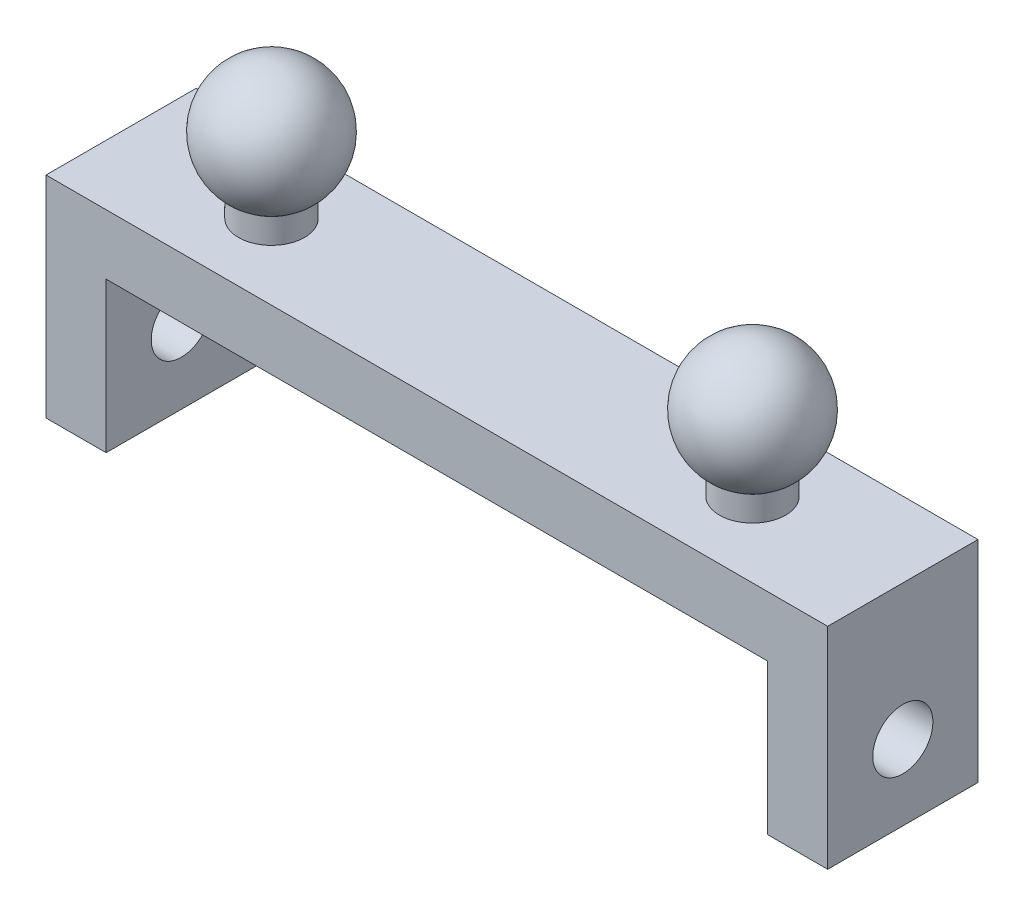
ISO-10303-21;
HEADER;
FILE_DESCRIPTION(('STEP AP214'),'2;1');
FILE_NAME('part.step','',(''),(''),'','','');
FILE_SCHEMA(('AUTOMOTIVE_DESIGN { 1 0 10303 214 1 1 1 1 }'));
ENDSEC;
DATA;
#1=APPLICATION_CONTEXT('core data for automotive mechanical design processes');
#2=APPLICATION_PROTOCOL_DEFINITION('international standard','automotive_design',2000,#1);
#3=PRODUCT_CONTEXT('',#1,'mechanical');
#4=PRODUCT('Part','Part','',(#3));
#5=PRODUCT_RELATED_PRODUCT_CATEGORY('part','',(#4));
#6=PRODUCT_DEFINITION_FORMATION('','',#4);
#7=PRODUCT_DEFINITION_CONTEXT('part definition',#1,'design');
#8=PRODUCT_DEFINITION('design','',#6,#7);
#9=PRODUCT_DEFINITION_SHAPE('','',#8);
#10=(LENGTH_UNIT() NAMED_UNIT(*) SI_UNIT(.MILLI.,.METRE.));
#11=(NAMED_UNIT(*) PLANE_ANGLE_UNIT() SI_UNIT($,.RADIAN.));
#12=(NAMED_UNIT(*) SI_UNIT($,.STERADIAN.) SOLID_ANGLE_UNIT());
#13=UNCERTAINTY_MEASURE_WITH_UNIT(LENGTH_MEASURE(1.E-05),#10,'distance_accuracy_value','');
#14=(GEOMETRIC_REPRESENTATION_CONTEXT(3) GLOBAL_UNCERTAINTY_ASSIGNED_CONTEXT((#13)) GLOBAL_UNIT_ASSIGNED_CONTEXT((#10,
#11,#12)) REPRESENTATION_CONTEXT('',''));
#15=CARTESIAN_POINT('',(0.,0.,0.));
#16=DIRECTION('',(0.,0.,1.));
#17=DIRECTION('',(1.,0.,0.));
#18=AXIS2_PLACEMENT_3D('',#15,#16,#17);
#19=CARTESIAN_POINT('',(11.,-2.,2.5));
#20=DIRECTION('',(0.,1.,0.));
#21=DIRECTION('',(-1.,0.,0.));
#22=AXIS2_PLACEMENT_3D('',#19,#20,#21);
#23=PLANE('',#22);
#24=DIRECTION('',(1.,0.,0.));
#25=VECTOR('',#24,1.);
#26=CARTESIAN_POINT('',(11.,-2.,-2.5));
#27=LINE('',#26,#25);
#28=CARTESIAN_POINT('',(-11.,-2.,-2.5));
#29=VERTEX_POINT('',#28);
#30=CARTESIAN_POINT('',(11.,-2.,-2.5));
#31=VERTEX_POINT('',#30);
#32=EDGE_CURVE('E132',#29,#31,#27,.T.);
#33=ORIENTED_EDGE('',*,*,#32,.T.);
#34=DIRECTION('',(0.,0.,-1.));
#35=VECTOR('',#34,1.);
#36=CARTESIAN_POINT('',(11.,-2.,2.5));
#37=LINE('',#36,#35);
#38=CARTESIAN_POINT('',(11.,-2.,2.5));
#39=VERTEX_POINT('',#38);
#40=EDGE_CURVE('E11',#39,#31,#37,.T.);
#41=ORIENTED_EDGE('',*,*,#40,.F.);
#42=DIRECTION('',(1.,0.,0.));
#43=VECTOR('',#42,1.);
#44=CARTESIAN_POINT('',(11.,-2.,2.5));
#45=LINE('',#44,#43);
#46=CARTESIAN_POINT('',(-11.,-2.,2.5));
#47=VERTEX_POINT('',#46);
#48=EDGE_CURVE('E89',#47,#39,#45,.T.);
#49=ORIENTED_EDGE('',*,*,#48,.F.);
#50=DIRECTION('',(0.,0.,-1.));
#51=VECTOR('',#50,1.);
#52=CARTESIAN_POINT('',(-11.,-2.,2.5));
#53=LINE('',#52,#51);
#54=EDGE_CURVE('E150',#47,#29,#53,.T.);
#55=ORIENTED_EDGE('',*,*,#54,.T.);
#56=EDGE_LOOP('',(#33,#41,#49,#55));
#57=FACE_BOUND('',#56,.T.);
#58=ADVANCED_FACE('F41',(#57),#23,.F.);
#59=CARTESIAN_POINT('',(11.,-7.,2.5));
#60=DIRECTION('',(1.,0.,0.));
#61=DIRECTION('',(0.,0.,-1.));
#62=AXIS2_PLACEMENT_3D('',#59,#60,#61);
#63=PLANE('',#62);
#64=CARTESIAN_POINT('',(11.,-4.5,0.));
#65=DIRECTION('',(1.,0.,0.));
#66=DIRECTION('',(0.,0.,-1.));
#67=AXIS2_PLACEMENT_3D('',#64,#65,#66);
#68=CIRCLE('',#67,1.);
#69=CARTESIAN_POINT('',(11.,-4.5,-1.));
#70=VERTEX_POINT('',#69);
#71=EDGE_CURVE('E145',#70,#70,#68,.T.);
#72=ORIENTED_EDGE('',*,*,#71,.T.);
#73=EDGE_LOOP('',(#72));
#74=FACE_BOUND('',#73,.T.);
#75=DIRECTION('',(0.,-1.,0.));
#76=VECTOR('',#75,1.);
#77=CARTESIAN_POINT('',(11.,-7.,-2.5));
#78=LINE('',#77,#76);
#79=CARTESIAN_POINT('',(11.,-7.,-2.5));
#80=VERTEX_POINT('',#79);
#81=EDGE_CURVE('E167',#31,#80,#78,.T.);
#82=ORIENTED_EDGE('',*,*,#81,.T.);
#83=DIRECTION('',(0.,0.,-1.));
#84=VECTOR('',#83,1.);
#85=CARTESIAN_POINT('',(11.,-7.,2.5));
#86=LINE('',#85,#84);
#87=CARTESIAN_POINT('',(11.,-7.,2.5));
#88=VERTEX_POINT('',#87);
#89=EDGE_CURVE('E50',#88,#80,#86,.T.);
#90=ORIENTED_EDGE('',*,*,#89,.F.);
#91=DIRECTION('',(0.,-1.,0.));
#92=VECTOR('',#91,1.);
#93=CARTESIAN_POINT('',(11.,-7.,2.5));
#94=LINE('',#93,#92);
#95=EDGE_CURVE('E161',#39,#88,#94,.T.);
#96=ORIENTED_EDGE('',*,*,#95,.F.);
#97=ORIENTED_EDGE('',*,*,#40,.T.);
#98=EDGE_LOOP('',(#82,#90,#96,#97));
#99=FACE_BOUND('',#98,.T.);
#100=ADVANCED_FACE('F191',(#74,#99),#63,.F.);
#101=CARTESIAN_POINT('',(13.,-7.,2.5));
#102=DIRECTION('',(0.,1.,0.));
#103=DIRECTION('',(0.,0.,1.));
#104=AXIS2_PLACEMENT_3D('',#101,#102,#103);
#105=PLANE('',#104);
#106=DIRECTION('',(1.,0.,0.));
#107=VECTOR('',#106,1.);
#108=CARTESIAN_POINT('',(13.,-7.,-2.5));
#109=LINE('',#108,#107);
#110=CARTESIAN_POINT('',(13.,-7.,-2.5));
#111=VERTEX_POINT('',#110);
#112=EDGE_CURVE('E76',#80,#111,#109,.T.);
#113=ORIENTED_EDGE('',*,*,#112,.T.);
#114=DIRECTION('',(0.,0.,-1.));
#115=VECTOR('',#114,1.);
#116=CARTESIAN_POINT('',(13.,-7.,2.5));
#117=LINE('',#116,#115);
#118=CARTESIAN_POINT('',(13.,-7.,2.5));
#119=VERTEX_POINT('',#118);
#120=EDGE_CURVE('E173',#119,#111,#117,.T.);
#121=ORIENTED_EDGE('',*,*,#120,.F.);
#122=DIRECTION('',(1.,0.,0.));
#123=VECTOR('',#122,1.);
#124=CARTESIAN_POINT('',(13.,-7.,2.5));
#125=LINE('',#124,#123);
#126=EDGE_CURVE('E163',#88,#119,#125,.T.);
#127=ORIENTED_EDGE('',*,*,#126,.F.);
#128=ORIENTED_EDGE('',*,*,#89,.T.);
#129=EDGE_LOOP('',(#113,#121,#127,#128));
#130=FACE_BOUND('',#129,.T.);
#131=ADVANCED_FACE('F177',(#130),#105,.F.);
#132=CARTESIAN_POINT('',(13.,0.,2.5));
#133=DIRECTION('',(-1.,0.,0.));
#134=DIRECTION('',(0.,0.,1.));
#135=AXIS2_PLACEMENT_3D('',#132,#133,#134);
#136=PLANE('',#135);
#137=CARTESIAN_POINT('',(13.,-4.5,0.));
#138=DIRECTION('',(1.,0.,0.));
#139=DIRECTION('',(0.,0.,-1.));
#140=AXIS2_PLACEMENT_3D('',#137,#138,#139);
#141=CIRCLE('',#140,1.);
#142=CARTESIAN_POINT('',(13.,-4.5,-1.));
#143=VERTEX_POINT('',#142);
#144=EDGE_CURVE('E222',#143,#143,#141,.T.);
#145=ORIENTED_EDGE('',*,*,#144,.F.);
#146=EDGE_LOOP('',(#145));
#147=FACE_BOUND('',#146,.T.);
#148=DIRECTION('',(0.,1.,0.));
#149=VECTOR('',#148,1.);
#150=CARTESIAN_POINT('',(13.,0.,-2.5));
#151=LINE('',#150,#149);
#152=CARTESIAN_POINT('',(13.,0.,-2.5));
#153=VERTEX_POINT('',#152);
#154=EDGE_CURVE('E82',#111,#153,#151,.T.);
#155=ORIENTED_EDGE('',*,*,#154,.T.);
#156=DIRECTION('',(0.,0.,-1.));
#157=VECTOR('',#156,1.);
#158=CARTESIAN_POINT('',(13.,0.,2.5));
#159=LINE('',#158,#157);
#160=CARTESIAN_POINT('',(13.,0.,2.5));
#161=VERTEX_POINT('',#160);
#162=EDGE_CURVE('E122',#161,#153,#159,.T.);
#163=ORIENTED_EDGE('',*,*,#162,.F.);
#164=DIRECTION('',(0.,1.,0.));
#165=VECTOR('',#164,1.);
#166=CARTESIAN_POINT('',(13.,0.,2.5));
#167=LINE('',#166,#165);
#168=EDGE_CURVE('E58',#119,#161,#167,.T.);
#169=ORIENTED_EDGE('',*,*,#168,.F.);
#170=ORIENTED_EDGE('',*,*,#120,.T.);
#171=EDGE_LOOP('',(#155,#163,#169,#170));
#172=FACE_BOUND('',#171,.T.);
#173=ADVANCED_FACE('F192',(#147,#172),#136,.F.);
#174=CARTESIAN_POINT('',(0.,0.,2.5));
#175=DIRECTION('',(0.,-1.,0.));
#176=DIRECTION('',(0.,0.,-1.));
#177=AXIS2_PLACEMENT_3D('',#174,#175,#176);
#178=PLANE('',#177);
#179=CARTESIAN_POINT('',(-8.,0.,0.));
#180=DIRECTION('',(0.,-1.,0.));
#181=DIRECTION('',(0.,0.,-1.));
#182=AXIS2_PLACEMENT_3D('',#179,#180,#181);
#183=CIRCLE('',#182,1.1);
#184=CARTESIAN_POINT('',(-8.,0.,-1.1));
#185=VERTEX_POINT('',#184);
#186=EDGE_CURVE('E234',#185,#185,#183,.T.);
#187=ORIENTED_EDGE('',*,*,#186,.T.);
#188=EDGE_LOOP('',(#187));
#189=FACE_BOUND('',#188,.T.);
#190=CARTESIAN_POINT('',(8.,0.,0.));
#191=DIRECTION('',(0.,-1.,0.));
#192=DIRECTION('',(0.,0.,-1.));
#193=AXIS2_PLACEMENT_3D('',#190,#191,#192);
#194=CIRCLE('',#193,1.1);
#195=CARTESIAN_POINT('',(8.,0.,-1.1));
#196=VERTEX_POINT('',#195);
#197=EDGE_CURVE('E227',#196,#196,#194,.T.);
#198=ORIENTED_EDGE('',*,*,#197,.T.);
#199=EDGE_LOOP('',(#198));
#200=FACE_BOUND('',#199,.T.);
#201=DIRECTION('',(-1.,0.,0.));
#202=VECTOR('',#201,1.);
#203=CARTESIAN_POINT('',(0.,0.,-2.5));
#204=LINE('',#203,#202);
#205=CARTESIAN_POINT('',(-13.,0.,-2.5));
#206=VERTEX_POINT('',#205);
#207=EDGE_CURVE('E128',#153,#206,#204,.T.);
#208=ORIENTED_EDGE('',*,*,#207,.T.);
#209=DIRECTION('',(0.,0.,-1.));
#210=VECTOR('',#209,1.);
#211=CARTESIAN_POINT('',(-13.,0.,2.5));
#212=LINE('',#211,#210);
#213=CARTESIAN_POINT('',(-13.,0.,2.5));
#214=VERTEX_POINT('',#213);
#215=EDGE_CURVE('E125',#214,#206,#212,.T.);
#216=ORIENTED_EDGE('',*,*,#215,.F.);
#217=DIRECTION('',(-1.,0.,0.));
#218=VECTOR('',#217,1.);
#219=CARTESIAN_POINT('',(0.,0.,2.5));
#220=LINE('',#219,#218);
#221=EDGE_CURVE('E114',#161,#214,#220,.T.);
#222=ORIENTED_EDGE('',*,*,#221,.F.);
#223=ORIENTED_EDGE('',*,*,#162,.T.);
#224=EDGE_LOOP('',(#208,#216,#222,#223));
#225=FACE_BOUND('',#224,.T.);
#226=ADVANCED_FACE('F126',(#189,#200,#225),#178,.F.);
#227=CARTESIAN_POINT('',(0.,0.,2.5));
#228=DIRECTION('',(0.,0.,-1.));
#229=DIRECTION('',(-1.,0.,0.));
#230=AXIS2_PLACEMENT_3D('',#227,#228,#229);
#231=PLANE('',#230);
#232=ORIENTED_EDGE('',*,*,#221,.T.);
#233=DIRECTION('',(0.,1.,0.));
#234=VECTOR('',#233,1.);
#235=CARTESIAN_POINT('',(-13.,0.,2.5));
#236=LINE('',#235,#234);
#237=CARTESIAN_POINT('',(-13.,-7.,2.5));
#238=VERTEX_POINT('',#237);
#239=EDGE_CURVE('E119',#238,#214,#236,.T.);
#240=ORIENTED_EDGE('',*,*,#239,.F.);
#241=DIRECTION('',(-1.,0.,0.));
#242=VECTOR('',#241,1.);
#243=CARTESIAN_POINT('',(-13.,-7.,2.5));
#244=LINE('',#243,#242);
#245=CARTESIAN_POINT('',(-11.,-7.,2.5));
#246=VERTEX_POINT('',#245);
#247=EDGE_CURVE('E136',#246,#238,#244,.T.);
#248=ORIENTED_EDGE('',*,*,#247,.F.);
#249=DIRECTION('',(0.,-1.,0.));
#250=VECTOR('',#249,1.);
#251=CARTESIAN_POINT('',(-11.,-7.,2.5));
#252=LINE('',#251,#250);
#253=EDGE_CURVE('E139',#47,#246,#252,.T.);
#254=ORIENTED_EDGE('',*,*,#253,.F.);
#255=ORIENTED_EDGE('',*,*,#48,.T.);
#256=ORIENTED_EDGE('',*,*,#95,.T.);
#257=ORIENTED_EDGE('',*,*,#126,.T.);
#258=ORIENTED_EDGE('',*,*,#168,.T.);
#259=EDGE_LOOP('',(#232,#240,#248,#254,#255,#256,#257,#258));
#260=FACE_BOUND('',#259,.T.);
#261=ADVANCED_FACE('F116',(#260),#231,.F.);
#262=CARTESIAN_POINT('',(0.,0.,-2.5));
#263=DIRECTION('',(0.,0.,-1.));
#264=DIRECTION('',(-1.,0.,0.));
#265=AXIS2_PLACEMENT_3D('',#262,#263,#264);
#266=PLANE('',#265);
#267=ORIENTED_EDGE('',*,*,#32,.F.);
#268=DIRECTION('',(0.,-1.,0.));
#269=VECTOR('',#268,1.);
#270=CARTESIAN_POINT('',(-11.,-7.,-2.5));
#271=LINE('',#270,#269);
#272=CARTESIAN_POINT('',(-11.,-7.,-2.5));
#273=VERTEX_POINT('',#272);
#274=EDGE_CURVE('E137',#29,#273,#271,.T.);
#275=ORIENTED_EDGE('',*,*,#274,.T.);
#276=DIRECTION('',(-1.,0.,0.));
#277=VECTOR('',#276,1.);
#278=CARTESIAN_POINT('',(-13.,-7.,-2.5));
#279=LINE('',#278,#277);
#280=CARTESIAN_POINT('',(-13.,-7.,-2.5));
#281=VERTEX_POINT('',#280);
#282=EDGE_CURVE('E142',#273,#281,#279,.T.);
#283=ORIENTED_EDGE('',*,*,#282,.T.);
#284=DIRECTION('',(0.,1.,0.));
#285=VECTOR('',#284,1.);
#286=CARTESIAN_POINT('',(-13.,0.,-2.5));
#287=LINE('',#286,#285);
#288=EDGE_CURVE('E151',#281,#206,#287,.T.);
#289=ORIENTED_EDGE('',*,*,#288,.T.);
#290=ORIENTED_EDGE('',*,*,#207,.F.);
#291=ORIENTED_EDGE('',*,*,#154,.F.);
#292=ORIENTED_EDGE('',*,*,#112,.F.);
#293=ORIENTED_EDGE('',*,*,#81,.F.);
#294=EDGE_LOOP('',(#267,#275,#283,#289,#290,#291,#292,#293));
#295=FACE_BOUND('',#294,.T.);
#296=ADVANCED_FACE('F182',(#295),#266,.T.);
#297=CARTESIAN_POINT('',(-13.,0.,2.5));
#298=DIRECTION('',(-1.,0.,0.));
#299=DIRECTION('',(0.,0.,1.));
#300=AXIS2_PLACEMENT_3D('',#297,#298,#299);
#301=PLANE('',#300);
#302=CARTESIAN_POINT('',(-13.,-4.5,0.));
#303=DIRECTION('',(1.,0.,0.));
#304=DIRECTION('',(0.,0.,-1.));
#305=AXIS2_PLACEMENT_3D('',#302,#303,#304);
#306=CIRCLE('',#305,1.);
#307=CARTESIAN_POINT('',(-13.,-4.5,-1.));
#308=VERTEX_POINT('',#307);
#309=EDGE_CURVE('E218',#308,#308,#306,.T.);
#310=ORIENTED_EDGE('',*,*,#309,.T.);
#311=EDGE_LOOP('',(#310));
#312=FACE_BOUND('',#311,.T.);
#313=ORIENTED_EDGE('',*,*,#288,.F.);
#314=DIRECTION('',(0.,0.,-1.));
#315=VECTOR('',#314,1.);
#316=CARTESIAN_POINT('',(-13.,-7.,2.5));
#317=LINE('',#316,#315);
#318=EDGE_CURVE('E133',#238,#281,#317,.T.);
#319=ORIENTED_EDGE('',*,*,#318,.F.);
#320=ORIENTED_EDGE('',*,*,#239,.T.);
#321=ORIENTED_EDGE('',*,*,#215,.T.);
#322=EDGE_LOOP('',(#313,#319,#320,#321));
#323=FACE_BOUND('',#322,.T.);
#324=ADVANCED_FACE('F135',(#312,#323),#301,.T.);
#325=CARTESIAN_POINT('',(-13.,-7.,2.5));
#326=DIRECTION('',(0.,-1.,0.));
#327=DIRECTION('',(0.,0.,-1.));
#328=AXIS2_PLACEMENT_3D('',#325,#326,#327);
#329=PLANE('',#328);
#330=ORIENTED_EDGE('',*,*,#282,.F.);
#331=DIRECTION('',(0.,0.,-1.));
#332=VECTOR('',#331,1.);
#333=CARTESIAN_POINT('',(-11.,-7.,2.5));
#334=LINE('',#333,#332);
#335=EDGE_CURVE('E157',#246,#273,#334,.T.);
#336=ORIENTED_EDGE('',*,*,#335,.F.);
#337=ORIENTED_EDGE('',*,*,#247,.T.);
#338=ORIENTED_EDGE('',*,*,#318,.T.);
#339=EDGE_LOOP('',(#330,#336,#337,#338));
#340=FACE_BOUND('',#339,.T.);
#341=ADVANCED_FACE('F186',(#340),#329,.T.);
#342=CARTESIAN_POINT('',(-11.,-7.,2.5));
#343=DIRECTION('',(1.,0.,0.));
#344=DIRECTION('',(0.,0.,-1.));
#345=AXIS2_PLACEMENT_3D('',#342,#343,#344);
#346=PLANE('',#345);
#347=CARTESIAN_POINT('',(-11.,-4.5,0.));
#348=DIRECTION('',(1.,0.,0.));
#349=DIRECTION('',(0.,0.,-1.));
#350=AXIS2_PLACEMENT_3D('',#347,#348,#349);
#351=CIRCLE('',#350,1.);
#352=CARTESIAN_POINT('',(-11.,-4.5,-1.));
#353=VERTEX_POINT('',#352);
#354=EDGE_CURVE('E44',#353,#353,#351,.T.);
#355=ORIENTED_EDGE('',*,*,#354,.F.);
#356=EDGE_LOOP('',(#355));
#357=FACE_BOUND('',#356,.T.);
#358=ORIENTED_EDGE('',*,*,#274,.F.);
#359=ORIENTED_EDGE('',*,*,#54,.F.);
#360=ORIENTED_EDGE('',*,*,#253,.T.);
#361=ORIENTED_EDGE('',*,*,#335,.T.);
#362=EDGE_LOOP('',(#358,#359,#360,#361));
#363=FACE_BOUND('',#362,.T.);
#364=ADVANCED_FACE('F189',(#357,#363),#346,.T.);
#365=CARTESIAN_POINT('',(-13.,-4.5,0.));
#366=DIRECTION('',(1.,0.,0.));
#367=DIRECTION('',(0.,0.,-1.));
#368=AXIS2_PLACEMENT_3D('',#365,#366,#367);
#369=CYLINDRICAL_SURFACE('',#368,1.);
#370=CARTESIAN_POINT('',(-11.,-4.5,-1.));
#371=CARTESIAN_POINT('',(-11.0208333333333,-4.5,-1.));
#372=CARTESIAN_POINT('',(-11.0416666666667,-4.5,-1.));
#373=CARTESIAN_POINT('',(-11.0833333333333,-4.5,-1.));
#374=CARTESIAN_POINT('',(-11.1041666666667,-4.5,-1.));
#375=CARTESIAN_POINT('',(-11.1458333333333,-4.5,-1.));
#376=CARTESIAN_POINT('',(-11.1666666666667,-4.5,-1.));
#377=CARTESIAN_POINT('',(-11.2083333333333,-4.5,-1.));
#378=CARTESIAN_POINT('',(-11.2291666666667,-4.5,-1.));
#379=CARTESIAN_POINT('',(-11.2708333333333,-4.5,-1.));
#380=CARTESIAN_POINT('',(-11.2916666666667,-4.5,-1.));
#381=CARTESIAN_POINT('',(-11.3333333333333,-4.5,-1.));
#382=CARTESIAN_POINT('',(-11.3541666666667,-4.5,-1.));
#383=CARTESIAN_POINT('',(-11.3958333333333,-4.5,-1.));
#384=CARTESIAN_POINT('',(-11.4166666666667,-4.5,-1.));
#385=CARTESIAN_POINT('',(-11.4583333333333,-4.5,-1.));
#386=CARTESIAN_POINT('',(-11.4791666666667,-4.5,-1.));
#387=CARTESIAN_POINT('',(-11.5208333333333,-4.5,-1.));
#388=CARTESIAN_POINT('',(-11.5416666666667,-4.5,-1.));
#389=CARTESIAN_POINT('',(-11.5833333333333,-4.5,-1.));
#390=CARTESIAN_POINT('',(-11.6041666666667,-4.5,-1.));
#391=CARTESIAN_POINT('',(-11.6458333333333,-4.5,-1.));
#392=CARTESIAN_POINT('',(-11.6666666666667,-4.5,-1.));
#393=CARTESIAN_POINT('',(-11.7083333333333,-4.5,-1.));
#394=CARTESIAN_POINT('',(-11.7291666666667,-4.5,-1.));
#395=CARTESIAN_POINT('',(-11.7708333333333,-4.5,-1.));
#396=CARTESIAN_POINT('',(-11.7916666666667,-4.5,-1.));
#397=CARTESIAN_POINT('',(-11.8333333333333,-4.5,-1.));
#398=CARTESIAN_POINT('',(-11.8541666666667,-4.5,-1.));
#399=CARTESIAN_POINT('',(-11.8958333333333,-4.5,-1.));
#400=CARTESIAN_POINT('',(-11.9166666666667,-4.5,-1.));
#401=CARTESIAN_POINT('',(-11.9583333333333,-4.5,-1.));
#402=CARTESIAN_POINT('',(-11.9791666666667,-4.5,-1.));
#403=CARTESIAN_POINT('',(-12.0208333333333,-4.5,-1.));
#404=CARTESIAN_POINT('',(-12.0416666666667,-4.5,-1.));
#405=CARTESIAN_POINT('',(-12.0833333333333,-4.5,-1.));
#406=CARTESIAN_POINT('',(-12.1041666666667,-4.5,-1.));
#407=CARTESIAN_POINT('',(-12.1458333333333,-4.5,-1.));
#408=CARTESIAN_POINT('',(-12.1666666666667,-4.5,-1.));
#409=CARTESIAN_POINT('',(-12.2083333333333,-4.5,-1.));
#410=CARTESIAN_POINT('',(-12.2291666666667,-4.5,-1.));
#411=CARTESIAN_POINT('',(-12.2708333333333,-4.5,-1.));
#412=CARTESIAN_POINT('',(-12.2916666666667,-4.5,-1.));
#413=CARTESIAN_POINT('',(-12.3333333333333,-4.5,-1.));
#414=CARTESIAN_POINT('',(-12.3541666666667,-4.5,-1.));
#415=CARTESIAN_POINT('',(-12.3958333333333,-4.5,-1.));
#416=CARTESIAN_POINT('',(-12.4166666666667,-4.5,-1.));
#417=CARTESIAN_POINT('',(-12.4583333333333,-4.5,-1.));
#418=CARTESIAN_POINT('',(-12.4791666666667,-4.5,-1.));
#419=CARTESIAN_POINT('',(-12.5208333333333,-4.5,-1.));
#420=CARTESIAN_POINT('',(-12.5416666666667,-4.5,-1.));
#421=CARTESIAN_POINT('',(-12.5833333333333,-4.5,-1.));
#422=CARTESIAN_POINT('',(-12.6041666666667,-4.5,-1.));
#423=CARTESIAN_POINT('',(-12.6458333333333,-4.5,-1.));
#424=CARTESIAN_POINT('',(-12.6666666666667,-4.5,-1.));
#425=CARTESIAN_POINT('',(-12.7083333333333,-4.5,-1.));
#426=CARTESIAN_POINT('',(-12.7291666666667,-4.5,-1.));
#427=CARTESIAN_POINT('',(-12.7708333333333,-4.5,-1.));
#428=CARTESIAN_POINT('',(-12.7916666666667,-4.5,-1.));
#429=CARTESIAN_POINT('',(-12.8333333333333,-4.5,-1.));
#430=CARTESIAN_POINT('',(-12.8541666666667,-4.5,-1.));
#431=CARTESIAN_POINT('',(-12.8958333333333,-4.5,-1.));
#432=CARTESIAN_POINT('',(-12.9166666666667,-4.5,-1.));
#433=CARTESIAN_POINT('',(-12.9583333333333,-4.5,-1.));
#434=CARTESIAN_POINT('',(-12.9791666666667,-4.5,-1.));
#435=CARTESIAN_POINT('',(-13.,-4.5,-1.));
#436=B_SPLINE_CURVE_WITH_KNOTS('',3,(#370,#371,#372,#373,#374,#375,#376,#377,#378,#379,#380,
#381,#382,#383,#384,#385,#386,#387,#388,#389,#390,#391,#392,#393,#394,#395,#396,#397,#398,#399,
#400,#401,#402,#403,#404,#405,#406,#407,#408,#409,#410,#411,#412,#413,#414,#415,#416,#417,#418,
#419,#420,#421,#422,#423,#424,#425,#426,#427,#428,#429,#430,#431,#432,#433,#434,#435),
.UNSPECIFIED.,.F.,.F.,(4,2,2,2,2,2,2,2,2,2,2,2,2,2,2,2,2,2,2,2,2,2,2,2,2,2,2,2,2,2,2,2,4),(0.,
0.0625000000000001,0.125,0.187499999999998,0.249999999999999,0.312499999999999,
0.374999999999999,0.437499999999999,0.499999999999999,0.562499999999999,0.624999999999999,
0.687499999999999,0.749999999999999,0.812499999999999,0.874999999999999,0.937499999999999,
0.999999999999999,1.0625,1.125,1.1875,1.25,1.3125,1.375,1.4375,1.5,1.5625,1.625,1.6875,1.75,
1.8125,1.875,1.9375,2.),.UNSPECIFIED.);
#437=EDGE_CURVE('BSEAM261',#353,#308,#436,.T.);
#438=ORIENTED_EDGE('',*,*,#354,.T.);
#439=ORIENTED_EDGE('',*,*,#309,.F.);
#440=ORIENTED_EDGE('',*,*,#437,.T.);
#441=ORIENTED_EDGE('',*,*,#437,.F.);
#442=EDGE_LOOP('',(#438,#440,#439,#441));
#443=FACE_BOUND('',#442,.T.);
#444=ADVANCED_FACE('F261',(#443),#369,.F.);
#445=CARTESIAN_POINT('',(13.,-4.5,-1.));
#446=CARTESIAN_POINT('',(12.9791666666667,-4.5,-1.));
#447=CARTESIAN_POINT('',(12.9583333333333,-4.5,-1.));
#448=CARTESIAN_POINT('',(12.9166666666667,-4.5,-1.));
#449=CARTESIAN_POINT('',(12.8958333333333,-4.5,-1.));
#450=CARTESIAN_POINT('',(12.8541666666667,-4.5,-1.));
#451=CARTESIAN_POINT('',(12.8333333333333,-4.5,-1.));
#452=CARTESIAN_POINT('',(12.7916666666667,-4.5,-1.));
#453=CARTESIAN_POINT('',(12.7708333333333,-4.5,-1.));
#454=CARTESIAN_POINT('',(12.7291666666667,-4.5,-1.));
#455=CARTESIAN_POINT('',(12.7083333333333,-4.5,-1.));
#456=CARTESIAN_POINT('',(12.6666666666667,-4.5,-1.));
#457=CARTESIAN_POINT('',(12.6458333333333,-4.5,-1.));
#458=CARTESIAN_POINT('',(12.6041666666667,-4.5,-1.));
#459=CARTESIAN_POINT('',(12.5833333333333,-4.5,-1.));
#460=CARTESIAN_POINT('',(12.5416666666667,-4.5,-1.));
#461=CARTESIAN_POINT('',(12.5208333333333,-4.5,-1.));
#462=CARTESIAN_POINT('',(12.4791666666667,-4.5,-1.));
#463=CARTESIAN_POINT('',(12.4583333333333,-4.5,-1.));
#464=CARTESIAN_POINT('',(12.4166666666667,-4.5,-1.));
#465=CARTESIAN_POINT('',(12.3958333333333,-4.5,-1.));
#466=CARTESIAN_POINT('',(12.3541666666667,-4.5,-1.));
#467=CARTESIAN_POINT('',(12.3333333333333,-4.5,-1.));
#468=CARTESIAN_POINT('',(12.2916666666667,-4.5,-1.));
#469=CARTESIAN_POINT('',(12.2708333333333,-4.5,-1.));
#470=CARTESIAN_POINT('',(12.2291666666667,-4.5,-1.));
#471=CARTESIAN_POINT('',(12.2083333333333,-4.5,-1.));
#472=CARTESIAN_POINT('',(12.1666666666667,-4.5,-1.));
#473=CARTESIAN_POINT('',(12.1458333333333,-4.5,-1.));
#474=CARTESIAN_POINT('',(12.1041666666667,-4.5,-1.));
#475=CARTESIAN_POINT('',(12.0833333333333,-4.5,-1.));
#476=CARTESIAN_POINT('',(12.0416666666667,-4.5,-1.));
#477=CARTESIAN_POINT('',(12.0208333333333,-4.5,-1.));
#478=CARTESIAN_POINT('',(11.9791666666667,-4.5,-1.));
#479=CARTESIAN_POINT('',(11.9583333333333,-4.5,-1.));
#480=CARTESIAN_POINT('',(11.9166666666667,-4.5,-1.));
#481=CARTESIAN_POINT('',(11.8958333333333,-4.5,-1.));
#482=CARTESIAN_POINT('',(11.8541666666667,-4.5,-1.));
#483=CARTESIAN_POINT('',(11.8333333333333,-4.5,-1.));
#484=CARTESIAN_POINT('',(11.7916666666667,-4.5,-1.));
#485=CARTESIAN_POINT('',(11.7708333333333,-4.5,-1.));
#486=CARTESIAN_POINT('',(11.7291666666667,-4.5,-1.));
#487=CARTESIAN_POINT('',(11.7083333333333,-4.5,-1.));
#488=CARTESIAN_POINT('',(11.6666666666667,-4.5,-1.));
#489=CARTESIAN_POINT('',(11.6458333333333,-4.5,-1.));
#490=CARTESIAN_POINT('',(11.6041666666667,-4.5,-1.));
#491=CARTESIAN_POINT('',(11.5833333333333,-4.5,-1.));
#492=CARTESIAN_POINT('',(11.5416666666667,-4.5,-1.));
#493=CARTESIAN_POINT('',(11.5208333333333,-4.5,-1.));
#494=CARTESIAN_POINT('',(11.4791666666667,-4.5,-1.));
#495=CARTESIAN_POINT('',(11.4583333333333,-4.5,-1.));
#496=CARTESIAN_POINT('',(11.4166666666667,-4.5,-1.));
#497=CARTESIAN_POINT('',(11.3958333333333,-4.5,-1.));
#498=CARTESIAN_POINT('',(11.3541666666667,-4.5,-1.));
#499=CARTESIAN_POINT('',(11.3333333333333,-4.5,-1.));
#500=CARTESIAN_POINT('',(11.2916666666667,-4.5,-1.));
#501=CARTESIAN_POINT('',(11.2708333333333,-4.5,-1.));
#502=CARTESIAN_POINT('',(11.2291666666667,-4.5,-1.));
#503=CARTESIAN_POINT('',(11.2083333333333,-4.5,-1.));
#504=CARTESIAN_POINT('',(11.1666666666667,-4.5,-1.));
#505=CARTESIAN_POINT('',(11.1458333333333,-4.5,-1.));
#506=CARTESIAN_POINT('',(11.1041666666667,-4.5,-1.));
#507=CARTESIAN_POINT('',(11.0833333333333,-4.5,-1.));
#508=CARTESIAN_POINT('',(11.0416666666667,-4.5,-1.));
#509=CARTESIAN_POINT('',(11.0208333333333,-4.5,-1.));
#510=CARTESIAN_POINT('',(11.,-4.5,-1.));
#511=B_SPLINE_CURVE_WITH_KNOTS('',3,(#445,#446,#447,#448,#449,#450,#451,#452,#453,#454,#455,
#456,#457,#458,#459,#460,#461,#462,#463,#464,#465,#466,#467,#468,#469,#470,#471,#472,#473,#474,
#475,#476,#477,#478,#479,#480,#481,#482,#483,#484,#485,#486,#487,#488,#489,#490,#491,#492,#493,
#494,#495,#496,#497,#498,#499,#500,#501,#502,#503,#504,#505,#506,#507,#508,#509,#510),
.UNSPECIFIED.,.F.,.F.,(4,2,2,2,2,2,2,2,2,2,2,2,2,2,2,2,2,2,2,2,2,2,2,2,2,2,2,2,2,2,2,2,4),(0.,
0.0625000000000001,0.125,0.1875,0.25,0.3125,0.375,0.4375,0.5,0.5625,0.625000000000001,
0.687500000000001,0.750000000000001,0.812500000000001,0.875000000000001,0.937500000000001,1.,
1.0625,1.125,1.1875,1.25,1.3125,1.375,1.4375,1.5,1.5625,1.625,1.6875,1.75,1.8125,1.875,1.9375,
2.),.UNSPECIFIED.);
#512=EDGE_CURVE('BSEAM259',#143,#70,#511,.T.);
#513=ORIENTED_EDGE('',*,*,#144,.T.);
#514=ORIENTED_EDGE('',*,*,#71,.F.);
#515=ORIENTED_EDGE('',*,*,#512,.T.);
#516=ORIENTED_EDGE('',*,*,#512,.F.);
#517=EDGE_LOOP('',(#513,#515,#514,#516));
#518=FACE_BOUND('',#517,.T.);
#519=ADVANCED_FACE('F259',(#518),#369,.F.);
#520=CARTESIAN_POINT('',(8.,0.,0.));
#521=DIRECTION('',(0.,-1.,0.));
#522=DIRECTION('',(0.,0.,-1.));
#523=AXIS2_PLACEMENT_3D('',#520,#521,#522);
#524=CYLINDRICAL_SURFACE('',#523,1.1);
#525=CARTESIAN_POINT('',(8.,0.829670691150993,0.));
#526=DIRECTION('',(0.,-1.,0.));
#527=DIRECTION('',(0.,0.,-1.));
#528=AXIS2_PLACEMENT_3D('',#525,#526,#527);
#529=CIRCLE('',#528,1.1);
#530=CARTESIAN_POINT('',(8.,0.829670691150993,-1.1));
#531=VERTEX_POINT('',#530);
#532=EDGE_CURVE('E231',#531,#531,#529,.T.);
#533=ORIENTED_EDGE('',*,*,#532,.T.);
#534=EDGE_LOOP('',(#533));
#535=FACE_BOUND('',#534,.T.);
#536=ORIENTED_EDGE('',*,*,#197,.F.);
#537=EDGE_LOOP('',(#536));
#538=FACE_BOUND('',#537,.T.);
#539=ADVANCED_FACE('F255',(#535,#538),#524,.T.);
#540=CARTESIAN_POINT('',(8.,2.5,0.));
#541=DIRECTION('',(0.,-1.,0.));
#542=DIRECTION('',(0.,0.,-1.));
#543=AXIS2_PLACEMENT_3D('',#540,#541,#542);
#544=SPHERICAL_SURFACE('',#543,2.);
#545=ORIENTED_EDGE('',*,*,#532,.F.);
#546=EDGE_LOOP('',(#545));
#547=FACE_BOUND('',#546,.T.);
#548=ADVANCED_FACE('F250',(#547),#544,.T.);
#549=CARTESIAN_POINT('',(-8.,0.,0.));
#550=DIRECTION('',(0.,-1.,0.));
#551=DIRECTION('',(0.,0.,-1.));
#552=AXIS2_PLACEMENT_3D('',#549,#550,#551);
#553=CYLINDRICAL_SURFACE('',#552,1.1);
#554=CARTESIAN_POINT('',(-8.,0.829670691150993,0.));
#555=DIRECTION('',(0.,-1.,0.));
#556=DIRECTION('',(0.,0.,-1.));
#557=AXIS2_PLACEMENT_3D('',#554,#555,#556);
#558=CIRCLE('',#557,1.1);
#559=CARTESIAN_POINT('',(-8.,0.829670691150993,-1.1));
#560=VERTEX_POINT('',#559);
#561=EDGE_CURVE('E237',#560,#560,#558,.T.);
#562=ORIENTED_EDGE('',*,*,#561,.T.);
#563=EDGE_LOOP('',(#562));
#564=FACE_BOUND('',#563,.T.);
#565=ORIENTED_EDGE('',*,*,#186,.F.);
#566=EDGE_LOOP('',(#565));
#567=FACE_BOUND('',#566,.T.);
#568=ADVANCED_FACE('F241',(#564,#567),#553,.T.);
#569=CARTESIAN_POINT('',(-8.,2.5,0.));
#570=DIRECTION('',(0.,-1.,0.));
#571=DIRECTION('',(0.,0.,1.));
#572=AXIS2_PLACEMENT_3D('',#569,#570,#571);
#573=SPHERICAL_SURFACE('',#572,2.);
#574=ORIENTED_EDGE('',*,*,#561,.F.);
#575=EDGE_LOOP('',(#574));
#576=FACE_BOUND('',#575,.T.);
#577=ADVANCED_FACE('F244',(#576),#573,.T.);
#578=CLOSED_SHELL('',(#58,#100,#131,#173,#226,#261,#296,#324,#341,#364,#444,#519,#539,#548,#568,#577));
#579=MANIFOLD_SOLID_BREP('B2',#578);
#580=ADVANCED_BREP_SHAPE_REPRESENTATION('',(#18,#579),#14);
#581=SHAPE_DEFINITION_REPRESENTATION(#9,#580);
ENDSEC;
END-ISO-10303-21;
